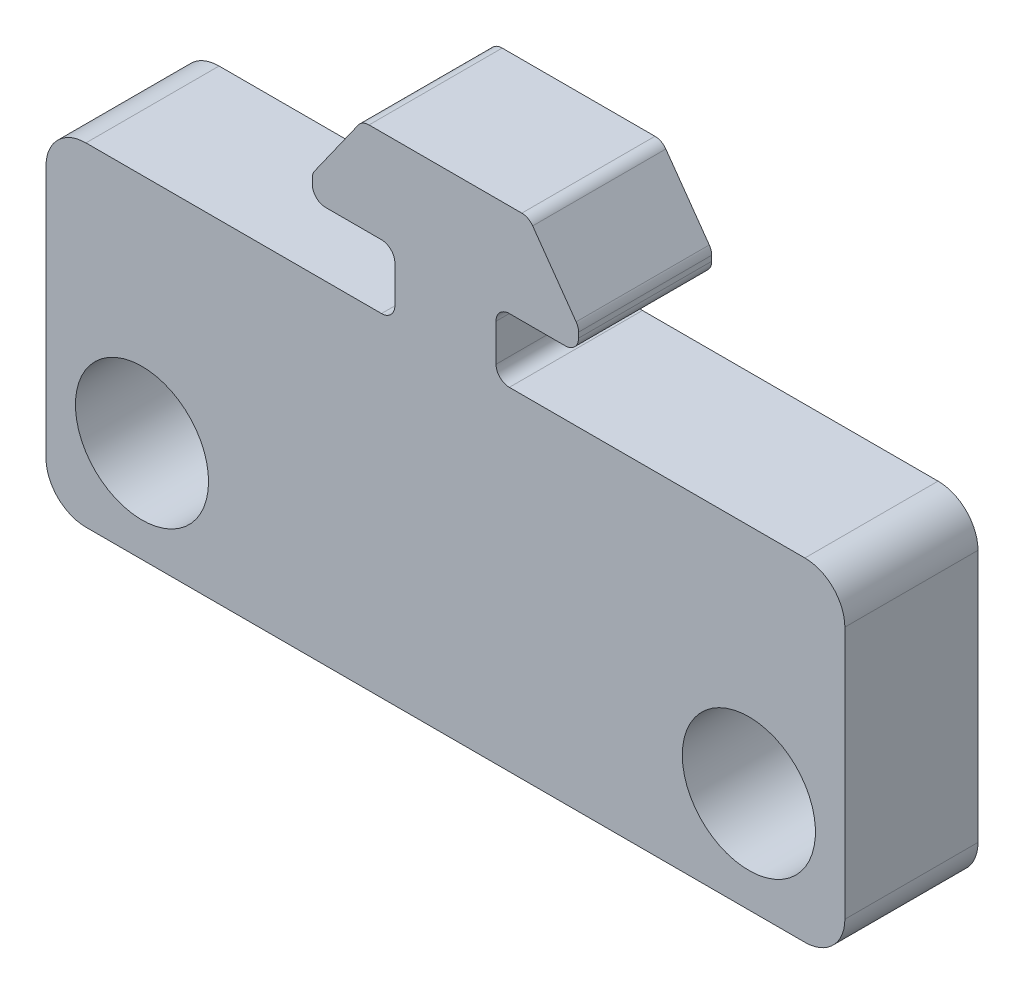
ISO-10303-21;
HEADER;
FILE_DESCRIPTION(('STEP AP214'),'2;1');
FILE_NAME('part.step','',(''),(''),'','','');
FILE_SCHEMA(('AUTOMOTIVE_DESIGN { 1 0 10303 214 1 1 1 1 }'));
ENDSEC;
DATA;
#1=APPLICATION_CONTEXT('core data for automotive mechanical design processes');
#2=APPLICATION_PROTOCOL_DEFINITION('international standard','automotive_design',2000,#1);
#3=PRODUCT_CONTEXT('',#1,'mechanical');
#4=PRODUCT('Part','Part','',(#3));
#5=PRODUCT_RELATED_PRODUCT_CATEGORY('part','',(#4));
#6=PRODUCT_DEFINITION_FORMATION('','',#4);
#7=PRODUCT_DEFINITION_CONTEXT('part definition',#1,'design');
#8=PRODUCT_DEFINITION('design','',#6,#7);
#9=PRODUCT_DEFINITION_SHAPE('','',#8);
#10=(LENGTH_UNIT() NAMED_UNIT(*) SI_UNIT(.MILLI.,.METRE.));
#11=(NAMED_UNIT(*) PLANE_ANGLE_UNIT() SI_UNIT($,.RADIAN.));
#12=(NAMED_UNIT(*) SI_UNIT($,.STERADIAN.) SOLID_ANGLE_UNIT());
#13=UNCERTAINTY_MEASURE_WITH_UNIT(LENGTH_MEASURE(1.E-05),#10,'distance_accuracy_value','');
#14=(GEOMETRIC_REPRESENTATION_CONTEXT(3) GLOBAL_UNCERTAINTY_ASSIGNED_CONTEXT((#13)) GLOBAL_UNIT_ASSIGNED_CONTEXT((#10,
#11,#12)) REPRESENTATION_CONTEXT('',''));
#15=CARTESIAN_POINT('',(0.,0.,0.));
#16=DIRECTION('',(0.,0.,1.));
#17=DIRECTION('',(1.,0.,0.));
#18=AXIS2_PLACEMENT_3D('',#15,#16,#17);
#19=CARTESIAN_POINT('',(0.,0.,10.));
#20=DIRECTION('',(0.,-1.,0.));
#21=DIRECTION('',(0.,0.,-1.));
#22=AXIS2_PLACEMENT_3D('',#19,#20,#21);
#23=PLANE('',#22);
#24=DIRECTION('',(-1.,0.,0.));
#25=VECTOR('',#24,1.);
#26=CARTESIAN_POINT('',(0.,0.,10.));
#27=LINE('',#26,#25);
#28=CARTESIAN_POINT('',(9.,0.,10.));
#29=VERTEX_POINT('',#28);
#30=CARTESIAN_POINT('',(4.8,0.,10.));
#31=VERTEX_POINT('',#30);
#32=EDGE_CURVE('E244',#29,#31,#27,.T.);
#33=ORIENTED_EDGE('',*,*,#32,.T.);
#34=DIRECTION('',(0.,0.,-1.));
#35=VECTOR('',#34,1.);
#36=CARTESIAN_POINT('',(4.8,0.,0.));
#37=LINE('',#36,#35);
#38=CARTESIAN_POINT('',(4.8,0.,0.));
#39=VERTEX_POINT('',#38);
#40=EDGE_CURVE('E349',#31,#39,#37,.T.);
#41=ORIENTED_EDGE('',*,*,#40,.T.);
#42=DIRECTION('',(-1.,0.,0.));
#43=VECTOR('',#42,1.);
#44=CARTESIAN_POINT('',(0.,0.,0.));
#45=LINE('',#44,#43);
#46=CARTESIAN_POINT('',(9.,0.,0.));
#47=VERTEX_POINT('',#46);
#48=EDGE_CURVE('E494',#47,#39,#45,.T.);
#49=ORIENTED_EDGE('',*,*,#48,.F.);
#50=DIRECTION('',(0.,0.,-1.));
#51=VECTOR('',#50,1.);
#52=CARTESIAN_POINT('',(9.,0.,10.));
#53=LINE('',#52,#51);
#54=EDGE_CURVE('E336',#47,#29,#53,.F.);
#55=ORIENTED_EDGE('',*,*,#54,.T.);
#56=EDGE_LOOP('',(#33,#41,#49,#55));
#57=FACE_BOUND('',#56,.T.);
#58=ADVANCED_FACE('F47',(#57),#23,.T.);
#59=CARTESIAN_POINT('',(-4.8,0.,0.));
#60=VERTEX_POINT('',#59);
#61=CARTESIAN_POINT('',(-9.,0.,0.));
#62=VERTEX_POINT('',#61);
#63=EDGE_CURVE('E499',#60,#62,#45,.T.);
#64=ORIENTED_EDGE('',*,*,#63,.F.);
#65=DIRECTION('',(0.,0.,-1.));
#66=VECTOR('',#65,1.);
#67=CARTESIAN_POINT('',(-4.8,0.,10.));
#68=LINE('',#67,#66);
#69=CARTESIAN_POINT('',(-4.8,0.,10.));
#70=VERTEX_POINT('',#69);
#71=EDGE_CURVE('E241',#60,#70,#68,.F.);
#72=ORIENTED_EDGE('',*,*,#71,.T.);
#73=CARTESIAN_POINT('',(-9.,0.,10.));
#74=VERTEX_POINT('',#73);
#75=EDGE_CURVE('E234',#70,#74,#27,.T.);
#76=ORIENTED_EDGE('',*,*,#75,.T.);
#77=DIRECTION('',(0.,0.,-1.));
#78=VECTOR('',#77,1.);
#79=CARTESIAN_POINT('',(-9.,0.,10.));
#80=LINE('',#79,#78);
#81=EDGE_CURVE('E239',#74,#62,#80,.T.);
#82=ORIENTED_EDGE('',*,*,#81,.T.);
#83=EDGE_LOOP('',(#64,#72,#76,#82));
#84=FACE_BOUND('',#83,.T.);
#85=ADVANCED_FACE('F237',(#84),#23,.T.);
#86=CARTESIAN_POINT('',(10.,0.,10.));
#87=DIRECTION('',(-1.,0.,0.));
#88=DIRECTION('',(0.,0.,1.));
#89=AXIS2_PLACEMENT_3D('',#86,#87,#88);
#90=PLANE('',#89);
#91=DIRECTION('',(0.,1.,0.));
#92=VECTOR('',#91,1.);
#93=CARTESIAN_POINT('',(10.,0.,10.));
#94=LINE('',#93,#92);
#95=CARTESIAN_POINT('',(10.,1.,10.));
#96=VERTEX_POINT('',#95);
#97=CARTESIAN_POINT('',(10.,1.39179018720823,10.));
#98=VERTEX_POINT('',#97);
#99=EDGE_CURVE('E479',#96,#98,#94,.T.);
#100=ORIENTED_EDGE('',*,*,#99,.F.);
#101=DIRECTION('',(0.,0.,-1.));
#102=VECTOR('',#101,1.);
#103=CARTESIAN_POINT('',(10.,1.,0.));
#104=LINE('',#103,#102);
#105=CARTESIAN_POINT('',(10.,1.,0.));
#106=VERTEX_POINT('',#105);
#107=EDGE_CURVE('E332',#96,#106,#104,.T.);
#108=ORIENTED_EDGE('',*,*,#107,.T.);
#109=DIRECTION('',(0.,1.,0.));
#110=VECTOR('',#109,1.);
#111=CARTESIAN_POINT('',(10.,0.,0.));
#112=LINE('',#111,#110);
#113=CARTESIAN_POINT('',(10.,1.39179018720823,0.));
#114=VERTEX_POINT('',#113);
#115=EDGE_CURVE('E498',#106,#114,#112,.T.);
#116=ORIENTED_EDGE('',*,*,#115,.T.);
#117=DIRECTION('',(0.,0.,-1.));
#118=VECTOR('',#117,1.);
#119=CARTESIAN_POINT('',(10.,1.39179018720823,10.));
#120=LINE('',#119,#118);
#121=EDGE_CURVE('E329',#114,#98,#120,.F.);
#122=ORIENTED_EDGE('',*,*,#121,.T.);
#123=EDGE_LOOP('',(#100,#108,#116,#122));
#124=FACE_BOUND('',#123,.T.);
#125=ADVANCED_FACE('F553',(#124),#90,.F.);
#126=CARTESIAN_POINT('',(7.46765073306512,5.28686501844186,10.));
#127=DIRECTION('',(-0.816164723344739,-0.57781930079187,0.));
#128=DIRECTION('',(0.57781930079187,-0.816164723344739,0.));
#129=AXIS2_PLACEMENT_3D('',#126,#127,#128);
#130=PLANE('',#129);
#131=DIRECTION('',(-0.57781930079187,0.816164723344739,0.));
#132=VECTOR('',#131,1.);
#133=CARTESIAN_POINT('',(7.46765073306512,5.28686501844186,0.));
#134=LINE('',#133,#132);
#135=CARTESIAN_POINT('',(9.81616472334474,1.9696094880001,0.));
#136=VERTEX_POINT('',#135);
#137=CARTESIAN_POINT('',(6.55369515590563,6.57781930079187,0.));
#138=VERTEX_POINT('',#137);
#139=EDGE_CURVE('E503',#136,#138,#134,.T.);
#140=ORIENTED_EDGE('',*,*,#139,.T.);
#141=DIRECTION('',(0.,0.,-1.));
#142=VECTOR('',#141,1.);
#143=CARTESIAN_POINT('',(6.55369515590563,6.57781930079187,10.));
#144=LINE('',#143,#142);
#145=CARTESIAN_POINT('',(6.55369515590563,6.57781930079187,10.));
#146=VERTEX_POINT('',#145);
#147=EDGE_CURVE('E326',#138,#146,#144,.F.);
#148=ORIENTED_EDGE('',*,*,#147,.T.);
#149=DIRECTION('',(-0.57781930079187,0.816164723344739,0.));
#150=VECTOR('',#149,1.);
#151=CARTESIAN_POINT('',(7.46765073306512,5.28686501844186,10.));
#152=LINE('',#151,#150);
#153=CARTESIAN_POINT('',(9.81616472334474,1.9696094880001,10.));
#154=VERTEX_POINT('',#153);
#155=EDGE_CURVE('E483',#154,#146,#152,.T.);
#156=ORIENTED_EDGE('',*,*,#155,.F.);
#157=DIRECTION('',(0.,0.,-1.));
#158=VECTOR('',#157,1.);
#159=CARTESIAN_POINT('',(9.81616472334474,1.9696094880001,10.));
#160=LINE('',#159,#158);
#161=EDGE_CURVE('E322',#154,#136,#160,.T.);
#162=ORIENTED_EDGE('',*,*,#161,.T.);
#163=EDGE_LOOP('',(#140,#148,#156,#162));
#164=FACE_BOUND('',#163,.T.);
#165=ADVANCED_FACE('F543',(#164),#130,.F.);
#166=CARTESIAN_POINT('',(0.,7.,10.));
#167=DIRECTION('',(0.,1.,0.));
#168=DIRECTION('',(0.,0.,1.));
#169=AXIS2_PLACEMENT_3D('',#166,#167,#168);
#170=PLANE('',#169);
#171=DIRECTION('',(1.,0.,0.));
#172=VECTOR('',#171,1.);
#173=CARTESIAN_POINT('',(0.,7.,0.));
#174=LINE('',#173,#172);
#175=CARTESIAN_POINT('',(-5.73753043256089,7.,0.));
#176=VERTEX_POINT('',#175);
#177=CARTESIAN_POINT('',(5.73753043256089,7.,0.));
#178=VERTEX_POINT('',#177);
#179=EDGE_CURVE('E507',#176,#178,#174,.T.);
#180=ORIENTED_EDGE('',*,*,#179,.F.);
#181=DIRECTION('',(0.,0.,-1.));
#182=VECTOR('',#181,1.);
#183=CARTESIAN_POINT('',(-5.73753043256089,7.,10.));
#184=LINE('',#183,#182);
#185=CARTESIAN_POINT('',(-5.73753043256089,7.,10.));
#186=VERTEX_POINT('',#185);
#187=EDGE_CURVE('E319',#176,#186,#184,.F.);
#188=ORIENTED_EDGE('',*,*,#187,.T.);
#189=DIRECTION('',(1.,0.,0.));
#190=VECTOR('',#189,1.);
#191=CARTESIAN_POINT('',(0.,7.,10.));
#192=LINE('',#191,#190);
#193=CARTESIAN_POINT('',(5.73753043256089,7.,10.));
#194=VERTEX_POINT('',#193);
#195=EDGE_CURVE('E487',#186,#194,#192,.T.);
#196=ORIENTED_EDGE('',*,*,#195,.T.);
#197=DIRECTION('',(0.,0.,-1.));
#198=VECTOR('',#197,1.);
#199=CARTESIAN_POINT('',(5.73753043256089,7.,0.));
#200=LINE('',#199,#198);
#201=EDGE_CURVE('E315',#194,#178,#200,.T.);
#202=ORIENTED_EDGE('',*,*,#201,.T.);
#203=EDGE_LOOP('',(#180,#188,#196,#202));
#204=FACE_BOUND('',#203,.T.);
#205=ADVANCED_FACE('F535',(#204),#170,.T.);
#206=CARTESIAN_POINT('',(-7.46765073306512,5.28686501844186,10.));
#207=DIRECTION('',(-0.816164723344739,0.57781930079187,0.));
#208=DIRECTION('',(-0.57781930079187,-0.816164723344739,0.));
#209=AXIS2_PLACEMENT_3D('',#206,#207,#208);
#210=PLANE('',#209);
#211=DIRECTION('',(0.57781930079187,0.816164723344739,0.));
#212=VECTOR('',#211,1.);
#213=CARTESIAN_POINT('',(-7.46765073306512,5.28686501844186,0.));
#214=LINE('',#213,#212);
#215=CARTESIAN_POINT('',(-9.81616472334474,1.9696094880001,0.));
#216=VERTEX_POINT('',#215);
#217=CARTESIAN_POINT('',(-6.55369515590563,6.57781930079187,0.));
#218=VERTEX_POINT('',#217);
#219=EDGE_CURVE('E510',#216,#218,#214,.T.);
#220=ORIENTED_EDGE('',*,*,#219,.F.);
#221=DIRECTION('',(0.,0.,-1.));
#222=VECTOR('',#221,1.);
#223=CARTESIAN_POINT('',(-9.81616472334474,1.9696094880001,10.));
#224=LINE('',#223,#222);
#225=CARTESIAN_POINT('',(-9.81616472334474,1.9696094880001,10.));
#226=VERTEX_POINT('',#225);
#227=EDGE_CURVE('E312',#216,#226,#224,.F.);
#228=ORIENTED_EDGE('',*,*,#227,.T.);
#229=DIRECTION('',(0.57781930079187,0.816164723344739,0.));
#230=VECTOR('',#229,1.);
#231=CARTESIAN_POINT('',(-7.46765073306512,5.28686501844186,10.));
#232=LINE('',#231,#230);
#233=CARTESIAN_POINT('',(-6.55369515590563,6.57781930079187,10.));
#234=VERTEX_POINT('',#233);
#235=EDGE_CURVE('E270',#226,#234,#232,.T.);
#236=ORIENTED_EDGE('',*,*,#235,.T.);
#237=DIRECTION('',(0.,0.,-1.));
#238=VECTOR('',#237,1.);
#239=CARTESIAN_POINT('',(-6.55369515590563,6.57781930079187,10.));
#240=LINE('',#239,#238);
#241=EDGE_CURVE('E257',#234,#218,#240,.T.);
#242=ORIENTED_EDGE('',*,*,#241,.T.);
#243=EDGE_LOOP('',(#220,#228,#236,#242));
#244=FACE_BOUND('',#243,.T.);
#245=ADVANCED_FACE('F526',(#244),#210,.T.);
#246=CARTESIAN_POINT('',(-10.,0.,10.));
#247=DIRECTION('',(-1.,0.,0.));
#248=DIRECTION('',(0.,0.,1.));
#249=AXIS2_PLACEMENT_3D('',#246,#247,#248);
#250=PLANE('',#249);
#251=DIRECTION('',(0.,1.,0.));
#252=VECTOR('',#251,1.);
#253=CARTESIAN_POINT('',(-10.,0.,0.));
#254=LINE('',#253,#252);
#255=CARTESIAN_POINT('',(-10.,1.,0.));
#256=VERTEX_POINT('',#255);
#257=CARTESIAN_POINT('',(-10.,1.39179018720823,0.));
#258=VERTEX_POINT('',#257);
#259=EDGE_CURVE('E245',#256,#258,#254,.T.);
#260=ORIENTED_EDGE('',*,*,#259,.F.);
#261=DIRECTION('',(0.,0.,-1.));
#262=VECTOR('',#261,1.);
#263=CARTESIAN_POINT('',(-10.,1.,10.));
#264=LINE('',#263,#262);
#265=CARTESIAN_POINT('',(-10.,1.,10.));
#266=VERTEX_POINT('',#265);
#267=EDGE_CURVE('E292',#256,#266,#264,.F.);
#268=ORIENTED_EDGE('',*,*,#267,.T.);
#269=DIRECTION('',(0.,1.,0.));
#270=VECTOR('',#269,1.);
#271=CARTESIAN_POINT('',(-10.,0.,10.));
#272=LINE('',#271,#270);
#273=CARTESIAN_POINT('',(-10.,1.39179018720823,10.));
#274=VERTEX_POINT('',#273);
#275=EDGE_CURVE('E253',#266,#274,#272,.T.);
#276=ORIENTED_EDGE('',*,*,#275,.T.);
#277=DIRECTION('',(0.,0.,-1.));
#278=VECTOR('',#277,1.);
#279=CARTESIAN_POINT('',(-10.,1.39179018720823,10.));
#280=LINE('',#279,#278);
#281=EDGE_CURVE('E288',#274,#258,#280,.T.);
#282=ORIENTED_EDGE('',*,*,#281,.T.);
#283=EDGE_LOOP('',(#260,#268,#276,#282));
#284=FACE_BOUND('',#283,.T.);
#285=ADVANCED_FACE('F518',(#284),#250,.T.);
#286=CARTESIAN_POINT('',(0.,0.,10.));
#287=DIRECTION('',(0.,0.,1.));
#288=DIRECTION('',(1.,0.,0.));
#289=AXIS2_PLACEMENT_3D('',#286,#287,#288);
#290=PLANE('',#289);
#291=CARTESIAN_POINT('',(-22.7909760636939,-22.227391231648,10.));
#292=DIRECTION('',(0.,0.,1.));
#293=DIRECTION('',(1.,0.,0.));
#294=AXIS2_PLACEMENT_3D('',#291,#292,#293);
#295=CIRCLE('',#294,5.);
#296=CARTESIAN_POINT('',(-17.7909760636939,-22.227391231648,10.));
#297=VERTEX_POINT('',#296);
#298=EDGE_CURVE('E457',#297,#297,#295,.T.);
#299=ORIENTED_EDGE('',*,*,#298,.F.);
#300=EDGE_LOOP('',(#299));
#301=FACE_BOUND('',#300,.T.);
#302=CARTESIAN_POINT('',(22.7909760636939,-22.227391231648,10.));
#303=DIRECTION('',(0.,0.,1.));
#304=DIRECTION('',(-1.,0.,0.));
#305=AXIS2_PLACEMENT_3D('',#302,#303,#304);
#306=CIRCLE('',#305,5.);
#307=CARTESIAN_POINT('',(17.7909760636939,-22.227391231648,10.));
#308=VERTEX_POINT('',#307);
#309=EDGE_CURVE('E920',#308,#308,#306,.T.);
#310=ORIENTED_EDGE('',*,*,#309,.F.);
#311=EDGE_LOOP('',(#310));
#312=FACE_BOUND('',#311,.T.);
#313=DIRECTION('',(-1.,0.,0.));
#314=VECTOR('',#313,1.);
#315=CARTESIAN_POINT('',(0.,-4.8,10.));
#316=LINE('',#315,#314);
#317=CARTESIAN_POINT('',(-4.8,-4.8,10.));
#318=VERTEX_POINT('',#317);
#319=CARTESIAN_POINT('',(-27.,-4.8,10.));
#320=VERTEX_POINT('',#319);
#321=EDGE_CURVE('E599',#318,#320,#316,.T.);
#322=ORIENTED_EDGE('',*,*,#321,.T.);
#323=CARTESIAN_POINT('',(-27.,-7.8,10.));
#324=DIRECTION('',(0.,0.,1.));
#325=DIRECTION('',(1.,0.,0.));
#326=AXIS2_PLACEMENT_3D('',#323,#324,#325);
#327=CIRCLE('',#326,3.);
#328=CARTESIAN_POINT('',(-30.,-7.8,10.));
#329=VERTEX_POINT('',#328);
#330=EDGE_CURVE('E419',#320,#329,#327,.T.);
#331=ORIENTED_EDGE('',*,*,#330,.T.);
#332=DIRECTION('',(0.,-1.,0.));
#333=VECTOR('',#332,1.);
#334=CARTESIAN_POINT('',(-30.,0.,10.));
#335=LINE('',#334,#333);
#336=CARTESIAN_POINT('',(-30.,-26.8,10.));
#337=VERTEX_POINT('',#336);
#338=EDGE_CURVE('E601',#329,#337,#335,.T.);
#339=ORIENTED_EDGE('',*,*,#338,.T.);
#340=CARTESIAN_POINT('',(-27.,-26.8,10.));
#341=DIRECTION('',(0.,0.,1.));
#342=DIRECTION('',(1.,0.,0.));
#343=AXIS2_PLACEMENT_3D('',#340,#341,#342);
#344=CIRCLE('',#343,3.);
#345=CARTESIAN_POINT('',(-27.,-29.8,10.));
#346=VERTEX_POINT('',#345);
#347=EDGE_CURVE('E416',#337,#346,#344,.T.);
#348=ORIENTED_EDGE('',*,*,#347,.T.);
#349=DIRECTION('',(1.,0.,0.));
#350=VECTOR('',#349,1.);
#351=CARTESIAN_POINT('',(0.,-29.8,10.));
#352=LINE('',#351,#350);
#353=CARTESIAN_POINT('',(27.,-29.8,10.));
#354=VERTEX_POINT('',#353);
#355=EDGE_CURVE('E475',#346,#354,#352,.T.);
#356=ORIENTED_EDGE('',*,*,#355,.T.);
#357=CARTESIAN_POINT('',(27.,-26.8,10.));
#358=DIRECTION('',(0.,0.,1.));
#359=DIRECTION('',(1.,0.,0.));
#360=AXIS2_PLACEMENT_3D('',#357,#358,#359);
#361=CIRCLE('',#360,3.);
#362=CARTESIAN_POINT('',(30.,-26.8,10.));
#363=VERTEX_POINT('',#362);
#364=EDGE_CURVE('E69',#354,#363,#361,.T.);
#365=ORIENTED_EDGE('',*,*,#364,.T.);
#366=DIRECTION('',(0.,-1.,0.));
#367=VECTOR('',#366,1.);
#368=CARTESIAN_POINT('',(30.,0.,10.));
#369=LINE('',#368,#367);
#370=CARTESIAN_POINT('',(30.,-7.8,10.));
#371=VERTEX_POINT('',#370);
#372=EDGE_CURVE('E441',#371,#363,#369,.T.);
#373=ORIENTED_EDGE('',*,*,#372,.F.);
#374=CARTESIAN_POINT('',(27.,-7.8,10.));
#375=DIRECTION('',(0.,0.,1.));
#376=DIRECTION('',(1.,0.,0.));
#377=AXIS2_PLACEMENT_3D('',#374,#375,#376);
#378=CIRCLE('',#377,3.);
#379=CARTESIAN_POINT('',(27.,-4.8,10.));
#380=VERTEX_POINT('',#379);
#381=EDGE_CURVE('E63',#371,#380,#378,.T.);
#382=ORIENTED_EDGE('',*,*,#381,.T.);
#383=DIRECTION('',(1.,0.,0.));
#384=VECTOR('',#383,1.);
#385=CARTESIAN_POINT('',(0.,-4.8,10.));
#386=LINE('',#385,#384);
#387=CARTESIAN_POINT('',(4.8,-4.8,10.));
#388=VERTEX_POINT('',#387);
#389=EDGE_CURVE('E582',#388,#380,#386,.T.);
#390=ORIENTED_EDGE('',*,*,#389,.F.);
#391=CARTESIAN_POINT('',(4.8,-3.8,10.));
#392=DIRECTION('',(0.,0.,1.));
#393=DIRECTION('',(1.,0.,0.));
#394=AXIS2_PLACEMENT_3D('',#391,#392,#393);
#395=CIRCLE('',#394,1.);
#396=CARTESIAN_POINT('',(3.8,-3.8,10.));
#397=VERTEX_POINT('',#396);
#398=EDGE_CURVE('E369',#388,#397,#395,.F.);
#399=ORIENTED_EDGE('',*,*,#398,.T.);
#400=DIRECTION('',(0.,-1.,0.));
#401=VECTOR('',#400,1.);
#402=CARTESIAN_POINT('',(3.8,0.,10.));
#403=LINE('',#402,#401);
#404=CARTESIAN_POINT('',(3.8,-1.,10.));
#405=VERTEX_POINT('',#404);
#406=EDGE_CURVE('E573',#405,#397,#403,.T.);
#407=ORIENTED_EDGE('',*,*,#406,.F.);
#408=CARTESIAN_POINT('',(4.8,-1.,10.));
#409=DIRECTION('',(0.,0.,1.));
#410=DIRECTION('',(1.,0.,0.));
#411=AXIS2_PLACEMENT_3D('',#408,#409,#410);
#412=CIRCLE('',#411,1.);
#413=EDGE_CURVE('E375',#405,#31,#412,.F.);
#414=ORIENTED_EDGE('',*,*,#413,.T.);
#415=ORIENTED_EDGE('',*,*,#32,.F.);
#416=CARTESIAN_POINT('',(9.,1.,10.));
#417=DIRECTION('',(0.,0.,1.));
#418=DIRECTION('',(1.,0.,0.));
#419=AXIS2_PLACEMENT_3D('',#416,#417,#418);
#420=CIRCLE('',#419,1.);
#421=EDGE_CURVE('E298',#29,#96,#420,.T.);
#422=ORIENTED_EDGE('',*,*,#421,.T.);
#423=ORIENTED_EDGE('',*,*,#99,.T.);
#424=CARTESIAN_POINT('',(9.,1.39179018720823,10.));
#425=DIRECTION('',(0.,0.,1.));
#426=DIRECTION('',(1.,0.,0.));
#427=AXIS2_PLACEMENT_3D('',#424,#425,#426);
#428=CIRCLE('',#427,1.);
#429=EDGE_CURVE('E295',#98,#154,#428,.T.);
#430=ORIENTED_EDGE('',*,*,#429,.T.);
#431=ORIENTED_EDGE('',*,*,#155,.T.);
#432=CARTESIAN_POINT('',(5.73753043256089,6.,10.));
#433=DIRECTION('',(0.,0.,1.));
#434=DIRECTION('',(1.,0.,0.));
#435=AXIS2_PLACEMENT_3D('',#432,#433,#434);
#436=CIRCLE('',#435,1.);
#437=EDGE_CURVE('E301',#146,#194,#436,.T.);
#438=ORIENTED_EDGE('',*,*,#437,.T.);
#439=ORIENTED_EDGE('',*,*,#195,.F.);
#440=CARTESIAN_POINT('',(-5.73753043256089,6.,10.));
#441=DIRECTION('',(0.,0.,1.));
#442=DIRECTION('',(1.,0.,0.));
#443=AXIS2_PLACEMENT_3D('',#440,#441,#442);
#444=CIRCLE('',#443,1.);
#445=EDGE_CURVE('E304',#186,#234,#444,.T.);
#446=ORIENTED_EDGE('',*,*,#445,.T.);
#447=ORIENTED_EDGE('',*,*,#235,.F.);
#448=CARTESIAN_POINT('',(-9.,1.39179018720823,10.));
#449=DIRECTION('',(0.,0.,1.));
#450=DIRECTION('',(1.,0.,0.));
#451=AXIS2_PLACEMENT_3D('',#448,#449,#450);
#452=CIRCLE('',#451,1.);
#453=EDGE_CURVE('E258',#226,#274,#452,.T.);
#454=ORIENTED_EDGE('',*,*,#453,.T.);
#455=ORIENTED_EDGE('',*,*,#275,.F.);
#456=CARTESIAN_POINT('',(-9.,1.,10.));
#457=DIRECTION('',(0.,0.,1.));
#458=DIRECTION('',(1.,0.,0.));
#459=AXIS2_PLACEMENT_3D('',#456,#457,#458);
#460=CIRCLE('',#459,1.);
#461=EDGE_CURVE('E249',#266,#74,#460,.T.);
#462=ORIENTED_EDGE('',*,*,#461,.T.);
#463=ORIENTED_EDGE('',*,*,#75,.F.);
#464=CARTESIAN_POINT('',(-4.8,-1.,10.));
#465=DIRECTION('',(0.,0.,1.));
#466=DIRECTION('',(1.,0.,0.));
#467=AXIS2_PLACEMENT_3D('',#464,#465,#466);
#468=CIRCLE('',#467,1.);
#469=CARTESIAN_POINT('',(-3.8,-1.,10.));
#470=VERTEX_POINT('',#469);
#471=EDGE_CURVE('E387',#70,#470,#468,.F.);
#472=ORIENTED_EDGE('',*,*,#471,.T.);
#473=DIRECTION('',(0.,-1.,0.));
#474=VECTOR('',#473,1.);
#475=CARTESIAN_POINT('',(-3.8,0.,10.));
#476=LINE('',#475,#474);
#477=CARTESIAN_POINT('',(-3.8,-3.8,10.));
#478=VERTEX_POINT('',#477);
#479=EDGE_CURVE('E595',#470,#478,#476,.T.);
#480=ORIENTED_EDGE('',*,*,#479,.T.);
#481=CARTESIAN_POINT('',(-4.8,-3.8,10.));
#482=DIRECTION('',(0.,0.,1.));
#483=DIRECTION('',(1.,0.,0.));
#484=AXIS2_PLACEMENT_3D('',#481,#482,#483);
#485=CIRCLE('',#484,1.);
#486=EDGE_CURVE('E381',#478,#318,#485,.F.);
#487=ORIENTED_EDGE('',*,*,#486,.T.);
#488=EDGE_LOOP('',(#322,#331,#339,#348,#356,#365,#373,#382,#390,#399,#407,#414,#415,#422,#423,
#430,#431,#438,#439,#446,#447,#454,#455,#462,#463,#472,#480,#487));
#489=FACE_BOUND('',#488,.T.);
#490=ADVANCED_FACE('F251',(#301,#312,#489),#290,.T.);
#491=CARTESIAN_POINT('',(0.,0.,0.));
#492=DIRECTION('',(0.,0.,1.));
#493=DIRECTION('',(1.,0.,0.));
#494=AXIS2_PLACEMENT_3D('',#491,#492,#493);
#495=PLANE('',#494);
#496=CARTESIAN_POINT('',(-22.7909760636939,-22.227391231648,0.));
#497=DIRECTION('',(0.,0.,1.));
#498=DIRECTION('',(1.,0.,0.));
#499=AXIS2_PLACEMENT_3D('',#496,#497,#498);
#500=CIRCLE('',#499,5.);
#501=CARTESIAN_POINT('',(-17.7909760636939,-22.227391231648,0.));
#502=VERTEX_POINT('',#501);
#503=EDGE_CURVE('E925',#502,#502,#500,.T.);
#504=ORIENTED_EDGE('',*,*,#503,.T.);
#505=EDGE_LOOP('',(#504));
#506=FACE_BOUND('',#505,.T.);
#507=CARTESIAN_POINT('',(22.7909760636939,-22.227391231648,0.));
#508=DIRECTION('',(0.,0.,1.));
#509=DIRECTION('',(-1.,0.,0.));
#510=AXIS2_PLACEMENT_3D('',#507,#508,#509);
#511=CIRCLE('',#510,5.);
#512=CARTESIAN_POINT('',(17.7909760636939,-22.227391231648,0.));
#513=VERTEX_POINT('',#512);
#514=EDGE_CURVE('E922',#513,#513,#511,.T.);
#515=ORIENTED_EDGE('',*,*,#514,.T.);
#516=EDGE_LOOP('',(#515));
#517=FACE_BOUND('',#516,.T.);
#518=DIRECTION('',(0.,-1.,0.));
#519=VECTOR('',#518,1.);
#520=CARTESIAN_POINT('',(-30.,0.,0.));
#521=LINE('',#520,#519);
#522=CARTESIAN_POINT('',(-30.,-7.8,0.));
#523=VERTEX_POINT('',#522);
#524=CARTESIAN_POINT('',(-30.,-26.8,0.));
#525=VERTEX_POINT('',#524);
#526=EDGE_CURVE('E472',#523,#525,#521,.T.);
#527=ORIENTED_EDGE('',*,*,#526,.F.);
#528=CARTESIAN_POINT('',(-27.,-7.8,0.));
#529=DIRECTION('',(0.,0.,1.));
#530=DIRECTION('',(1.,0.,0.));
#531=AXIS2_PLACEMENT_3D('',#528,#529,#530);
#532=CIRCLE('',#531,3.);
#533=CARTESIAN_POINT('',(-27.,-4.8,0.));
#534=VERTEX_POINT('',#533);
#535=EDGE_CURVE('E406',#523,#534,#532,.F.);
#536=ORIENTED_EDGE('',*,*,#535,.T.);
#537=DIRECTION('',(-1.,0.,0.));
#538=VECTOR('',#537,1.);
#539=CARTESIAN_POINT('',(0.,-4.8,0.));
#540=LINE('',#539,#538);
#541=CARTESIAN_POINT('',(-4.8,-4.8,0.));
#542=VERTEX_POINT('',#541);
#543=EDGE_CURVE('E468',#542,#534,#540,.T.);
#544=ORIENTED_EDGE('',*,*,#543,.F.);
#545=CARTESIAN_POINT('',(-4.8,-3.8,0.));
#546=DIRECTION('',(0.,0.,1.));
#547=DIRECTION('',(1.,0.,0.));
#548=AXIS2_PLACEMENT_3D('',#545,#546,#547);
#549=CIRCLE('',#548,1.);
#550=CARTESIAN_POINT('',(-3.8,-3.8,0.));
#551=VERTEX_POINT('',#550);
#552=EDGE_CURVE('E378',#542,#551,#549,.T.);
#553=ORIENTED_EDGE('',*,*,#552,.T.);
#554=DIRECTION('',(0.,-1.,0.));
#555=VECTOR('',#554,1.);
#556=CARTESIAN_POINT('',(-3.8,0.,0.));
#557=LINE('',#556,#555);
#558=CARTESIAN_POINT('',(-3.8,-1.,0.));
#559=VERTEX_POINT('',#558);
#560=EDGE_CURVE('E464',#559,#551,#557,.T.);
#561=ORIENTED_EDGE('',*,*,#560,.F.);
#562=CARTESIAN_POINT('',(-4.8,-1.,0.));
#563=DIRECTION('',(0.,0.,1.));
#564=DIRECTION('',(1.,0.,0.));
#565=AXIS2_PLACEMENT_3D('',#562,#563,#564);
#566=CIRCLE('',#565,1.);
#567=EDGE_CURVE('E384',#559,#60,#566,.T.);
#568=ORIENTED_EDGE('',*,*,#567,.T.);
#569=ORIENTED_EDGE('',*,*,#63,.T.);
#570=CARTESIAN_POINT('',(-9.,1.,0.));
#571=DIRECTION('',(0.,0.,1.));
#572=DIRECTION('',(1.,0.,0.));
#573=AXIS2_PLACEMENT_3D('',#570,#571,#572);
#574=CIRCLE('',#573,1.);
#575=EDGE_CURVE('E262',#62,#256,#574,.F.);
#576=ORIENTED_EDGE('',*,*,#575,.T.);
#577=ORIENTED_EDGE('',*,*,#259,.T.);
#578=CARTESIAN_POINT('',(-9.,1.39179018720823,0.));
#579=DIRECTION('',(0.,0.,1.));
#580=DIRECTION('',(1.,0.,0.));
#581=AXIS2_PLACEMENT_3D('',#578,#579,#580);
#582=CIRCLE('',#581,1.);
#583=EDGE_CURVE('E283',#258,#216,#582,.F.);
#584=ORIENTED_EDGE('',*,*,#583,.T.);
#585=ORIENTED_EDGE('',*,*,#219,.T.);
#586=CARTESIAN_POINT('',(-5.73753043256089,6.,0.));
#587=DIRECTION('',(0.,0.,1.));
#588=DIRECTION('',(1.,0.,0.));
#589=AXIS2_PLACEMENT_3D('',#586,#587,#588);
#590=CIRCLE('',#589,1.);
#591=EDGE_CURVE('E280',#218,#176,#590,.F.);
#592=ORIENTED_EDGE('',*,*,#591,.T.);
#593=ORIENTED_EDGE('',*,*,#179,.T.);
#594=CARTESIAN_POINT('',(5.73753043256089,6.,0.));
#595=DIRECTION('',(0.,0.,1.));
#596=DIRECTION('',(1.,0.,0.));
#597=AXIS2_PLACEMENT_3D('',#594,#595,#596);
#598=CIRCLE('',#597,1.);
#599=EDGE_CURVE('E277',#178,#138,#598,.F.);
#600=ORIENTED_EDGE('',*,*,#599,.T.);
#601=ORIENTED_EDGE('',*,*,#139,.F.);
#602=CARTESIAN_POINT('',(9.,1.39179018720823,0.));
#603=DIRECTION('',(0.,0.,1.));
#604=DIRECTION('',(1.,0.,0.));
#605=AXIS2_PLACEMENT_3D('',#602,#603,#604);
#606=CIRCLE('',#605,1.);
#607=EDGE_CURVE('E264',#136,#114,#606,.F.);
#608=ORIENTED_EDGE('',*,*,#607,.T.);
#609=ORIENTED_EDGE('',*,*,#115,.F.);
#610=CARTESIAN_POINT('',(9.,1.,0.));
#611=DIRECTION('',(0.,0.,1.));
#612=DIRECTION('',(1.,0.,0.));
#613=AXIS2_PLACEMENT_3D('',#610,#611,#612);
#614=CIRCLE('',#613,1.);
#615=EDGE_CURVE('E268',#106,#47,#614,.F.);
#616=ORIENTED_EDGE('',*,*,#615,.T.);
#617=ORIENTED_EDGE('',*,*,#48,.T.);
#618=CARTESIAN_POINT('',(4.8,-1.,0.));
#619=DIRECTION('',(0.,0.,1.));
#620=DIRECTION('',(1.,0.,0.));
#621=AXIS2_PLACEMENT_3D('',#618,#619,#620);
#622=CIRCLE('',#621,1.);
#623=CARTESIAN_POINT('',(3.8,-1.,0.));
#624=VERTEX_POINT('',#623);
#625=EDGE_CURVE('E372',#39,#624,#622,.T.);
#626=ORIENTED_EDGE('',*,*,#625,.T.);
#627=DIRECTION('',(0.,-1.,0.));
#628=VECTOR('',#627,1.);
#629=CARTESIAN_POINT('',(3.8,0.,0.));
#630=LINE('',#629,#628);
#631=CARTESIAN_POINT('',(3.8,-3.8,0.));
#632=VERTEX_POINT('',#631);
#633=EDGE_CURVE('E455',#624,#632,#630,.T.);
#634=ORIENTED_EDGE('',*,*,#633,.T.);
#635=CARTESIAN_POINT('',(4.8,-3.8,0.));
#636=DIRECTION('',(0.,0.,1.));
#637=DIRECTION('',(1.,0.,0.));
#638=AXIS2_PLACEMENT_3D('',#635,#636,#637);
#639=CIRCLE('',#638,1.);
#640=CARTESIAN_POINT('',(4.8,-4.8,0.));
#641=VERTEX_POINT('',#640);
#642=EDGE_CURVE('E366',#632,#641,#639,.T.);
#643=ORIENTED_EDGE('',*,*,#642,.T.);
#644=DIRECTION('',(1.,0.,0.));
#645=VECTOR('',#644,1.);
#646=CARTESIAN_POINT('',(0.,-4.8,0.));
#647=LINE('',#646,#645);
#648=CARTESIAN_POINT('',(27.,-4.8,0.));
#649=VERTEX_POINT('',#648);
#650=EDGE_CURVE('E450',#641,#649,#647,.T.);
#651=ORIENTED_EDGE('',*,*,#650,.T.);
#652=CARTESIAN_POINT('',(27.,-7.8,0.));
#653=DIRECTION('',(0.,0.,1.));
#654=DIRECTION('',(1.,0.,0.));
#655=AXIS2_PLACEMENT_3D('',#652,#653,#654);
#656=CIRCLE('',#655,3.);
#657=CARTESIAN_POINT('',(30.,-7.8,0.));
#658=VERTEX_POINT('',#657);
#659=EDGE_CURVE('E400',#649,#658,#656,.F.);
#660=ORIENTED_EDGE('',*,*,#659,.T.);
#661=DIRECTION('',(0.,-1.,0.));
#662=VECTOR('',#661,1.);
#663=CARTESIAN_POINT('',(30.,0.,0.));
#664=LINE('',#663,#662);
#665=CARTESIAN_POINT('',(30.,-26.8,0.));
#666=VERTEX_POINT('',#665);
#667=EDGE_CURVE('E439',#658,#666,#664,.T.);
#668=ORIENTED_EDGE('',*,*,#667,.T.);
#669=CARTESIAN_POINT('',(27.,-26.8,0.));
#670=DIRECTION('',(0.,0.,1.));
#671=DIRECTION('',(1.,0.,0.));
#672=AXIS2_PLACEMENT_3D('',#669,#670,#671);
#673=CIRCLE('',#672,3.);
#674=CARTESIAN_POINT('',(27.,-29.8,0.));
#675=VERTEX_POINT('',#674);
#676=EDGE_CURVE('E397',#666,#675,#673,.F.);
#677=ORIENTED_EDGE('',*,*,#676,.T.);
#678=DIRECTION('',(1.,0.,0.));
#679=VECTOR('',#678,1.);
#680=CARTESIAN_POINT('',(0.,-29.8,0.));
#681=LINE('',#680,#679);
#682=CARTESIAN_POINT('',(-27.,-29.8,0.));
#683=VERTEX_POINT('',#682);
#684=EDGE_CURVE('E451',#683,#675,#681,.T.);
#685=ORIENTED_EDGE('',*,*,#684,.F.);
#686=CARTESIAN_POINT('',(-27.,-26.8,0.));
#687=DIRECTION('',(0.,0.,1.));
#688=DIRECTION('',(1.,0.,0.));
#689=AXIS2_PLACEMENT_3D('',#686,#687,#688);
#690=CIRCLE('',#689,3.);
#691=EDGE_CURVE('E403',#683,#525,#690,.F.);
#692=ORIENTED_EDGE('',*,*,#691,.T.);
#693=EDGE_LOOP('',(#527,#536,#544,#553,#561,#568,#569,#576,#577,#584,#585,#592,#593,#600,#601,
#608,#609,#616,#617,#626,#634,#643,#651,#660,#668,#677,#685,#692));
#694=FACE_BOUND('',#693,.T.);
#695=ADVANCED_FACE('F445',(#506,#517,#694),#495,.F.);
#696=CARTESIAN_POINT('',(0.,-29.8,10.));
#697=DIRECTION('',(0.,1.,0.));
#698=DIRECTION('',(-1.,0.,0.));
#699=AXIS2_PLACEMENT_3D('',#696,#697,#698);
#700=PLANE('',#699);
#701=ORIENTED_EDGE('',*,*,#355,.F.);
#702=DIRECTION('',(0.,0.,-1.));
#703=VECTOR('',#702,1.);
#704=CARTESIAN_POINT('',(-27.,-29.8,10.));
#705=LINE('',#704,#703);
#706=EDGE_CURVE('E425',#346,#683,#705,.T.);
#707=ORIENTED_EDGE('',*,*,#706,.T.);
#708=ORIENTED_EDGE('',*,*,#684,.T.);
#709=DIRECTION('',(0.,0.,-1.));
#710=VECTOR('',#709,1.);
#711=CARTESIAN_POINT('',(27.,-29.8,10.));
#712=LINE('',#711,#710);
#713=EDGE_CURVE('E422',#675,#354,#712,.F.);
#714=ORIENTED_EDGE('',*,*,#713,.T.);
#715=EDGE_LOOP('',(#701,#707,#708,#714));
#716=FACE_BOUND('',#715,.T.);
#717=ADVANCED_FACE('F636',(#716),#700,.F.);
#718=CARTESIAN_POINT('',(30.,0.,10.));
#719=DIRECTION('',(1.,0.,0.));
#720=DIRECTION('',(0.,0.,-1.));
#721=AXIS2_PLACEMENT_3D('',#718,#719,#720);
#722=PLANE('',#721);
#723=ORIENTED_EDGE('',*,*,#667,.F.);
#724=DIRECTION('',(0.,0.,-1.));
#725=VECTOR('',#724,1.);
#726=CARTESIAN_POINT('',(30.,-7.8,10.));
#727=LINE('',#726,#725);
#728=EDGE_CURVE('E11',#658,#371,#727,.F.);
#729=ORIENTED_EDGE('',*,*,#728,.T.);
#730=ORIENTED_EDGE('',*,*,#372,.T.);
#731=DIRECTION('',(0.,0.,-1.));
#732=VECTOR('',#731,1.);
#733=CARTESIAN_POINT('',(30.,-26.8,0.));
#734=LINE('',#733,#732);
#735=EDGE_CURVE('E56',#363,#666,#734,.T.);
#736=ORIENTED_EDGE('',*,*,#735,.T.);
#737=EDGE_LOOP('',(#723,#729,#730,#736));
#738=FACE_BOUND('',#737,.T.);
#739=ADVANCED_FACE('F438',(#738),#722,.T.);
#740=CARTESIAN_POINT('',(0.,-4.8,10.));
#741=DIRECTION('',(0.,1.,0.));
#742=DIRECTION('',(-1.,0.,0.));
#743=AXIS2_PLACEMENT_3D('',#740,#741,#742);
#744=PLANE('',#743);
#745=ORIENTED_EDGE('',*,*,#389,.T.);
#746=DIRECTION('',(0.,0.,-1.));
#747=VECTOR('',#746,1.);
#748=CARTESIAN_POINT('',(27.,-4.8,10.));
#749=LINE('',#748,#747);
#750=EDGE_CURVE('E429',#380,#649,#749,.T.);
#751=ORIENTED_EDGE('',*,*,#750,.T.);
#752=ORIENTED_EDGE('',*,*,#650,.F.);
#753=DIRECTION('',(0.,0.,-1.));
#754=VECTOR('',#753,1.);
#755=CARTESIAN_POINT('',(4.8,-4.8,10.));
#756=LINE('',#755,#754);
#757=EDGE_CURVE('E346',#641,#388,#756,.F.);
#758=ORIENTED_EDGE('',*,*,#757,.T.);
#759=EDGE_LOOP('',(#745,#751,#752,#758));
#760=FACE_BOUND('',#759,.T.);
#761=ADVANCED_FACE('F580',(#760),#744,.T.);
#762=CARTESIAN_POINT('',(3.8,0.,10.));
#763=DIRECTION('',(1.,0.,0.));
#764=DIRECTION('',(0.,1.,0.));
#765=AXIS2_PLACEMENT_3D('',#762,#763,#764);
#766=PLANE('',#765);
#767=ORIENTED_EDGE('',*,*,#406,.T.);
#768=DIRECTION('',(0.,0.,-1.));
#769=VECTOR('',#768,1.);
#770=CARTESIAN_POINT('',(3.8,-3.8,0.));
#771=LINE('',#770,#769);
#772=EDGE_CURVE('E342',#397,#632,#771,.T.);
#773=ORIENTED_EDGE('',*,*,#772,.T.);
#774=ORIENTED_EDGE('',*,*,#633,.F.);
#775=DIRECTION('',(0.,0.,-1.));
#776=VECTOR('',#775,1.);
#777=CARTESIAN_POINT('',(3.8,-1.,10.));
#778=LINE('',#777,#776);
#779=EDGE_CURVE('E339',#624,#405,#778,.F.);
#780=ORIENTED_EDGE('',*,*,#779,.T.);
#781=EDGE_LOOP('',(#767,#773,#774,#780));
#782=FACE_BOUND('',#781,.T.);
#783=ADVANCED_FACE('F570',(#782),#766,.T.);
#784=CARTESIAN_POINT('',(-3.8,0.,10.));
#785=DIRECTION('',(1.,0.,0.));
#786=DIRECTION('',(0.,1.,0.));
#787=AXIS2_PLACEMENT_3D('',#784,#785,#786);
#788=PLANE('',#787);
#789=ORIENTED_EDGE('',*,*,#560,.T.);
#790=DIRECTION('',(0.,0.,-1.));
#791=VECTOR('',#790,1.);
#792=CARTESIAN_POINT('',(-3.8,-3.8,10.));
#793=LINE('',#792,#791);
#794=EDGE_CURVE('E361',#551,#478,#793,.F.);
#795=ORIENTED_EDGE('',*,*,#794,.T.);
#796=ORIENTED_EDGE('',*,*,#479,.F.);
#797=DIRECTION('',(0.,0.,-1.));
#798=VECTOR('',#797,1.);
#799=CARTESIAN_POINT('',(-3.8,-1.,10.));
#800=LINE('',#799,#798);
#801=EDGE_CURVE('E357',#470,#559,#800,.T.);
#802=ORIENTED_EDGE('',*,*,#801,.T.);
#803=EDGE_LOOP('',(#789,#795,#796,#802));
#804=FACE_BOUND('',#803,.T.);
#805=ADVANCED_FACE('F614',(#804),#788,.F.);
#806=CARTESIAN_POINT('',(0.,-4.8,10.));
#807=DIRECTION('',(0.,-1.,0.));
#808=DIRECTION('',(1.,0.,0.));
#809=AXIS2_PLACEMENT_3D('',#806,#807,#808);
#810=PLANE('',#809);
#811=ORIENTED_EDGE('',*,*,#543,.T.);
#812=DIRECTION('',(0.,0.,-1.));
#813=VECTOR('',#812,1.);
#814=CARTESIAN_POINT('',(-27.,-4.8,10.));
#815=LINE('',#814,#813);
#816=EDGE_CURVE('E409',#534,#320,#815,.F.);
#817=ORIENTED_EDGE('',*,*,#816,.T.);
#818=ORIENTED_EDGE('',*,*,#321,.F.);
#819=DIRECTION('',(0.,0.,-1.));
#820=VECTOR('',#819,1.);
#821=CARTESIAN_POINT('',(-4.8,-4.8,0.));
#822=LINE('',#821,#820);
#823=EDGE_CURVE('E353',#318,#542,#822,.T.);
#824=ORIENTED_EDGE('',*,*,#823,.T.);
#825=EDGE_LOOP('',(#811,#817,#818,#824));
#826=FACE_BOUND('',#825,.T.);
#827=ADVANCED_FACE('F622',(#826),#810,.F.);
#828=CARTESIAN_POINT('',(-30.,0.,10.));
#829=DIRECTION('',(1.,0.,0.));
#830=DIRECTION('',(0.,0.,-1.));
#831=AXIS2_PLACEMENT_3D('',#828,#829,#830);
#832=PLANE('',#831);
#833=ORIENTED_EDGE('',*,*,#338,.F.);
#834=DIRECTION('',(0.,0.,-1.));
#835=VECTOR('',#834,1.);
#836=CARTESIAN_POINT('',(-30.,-7.8,10.));
#837=LINE('',#836,#835);
#838=EDGE_CURVE('E393',#329,#523,#837,.T.);
#839=ORIENTED_EDGE('',*,*,#838,.T.);
#840=ORIENTED_EDGE('',*,*,#526,.T.);
#841=DIRECTION('',(0.,0.,-1.));
#842=VECTOR('',#841,1.);
#843=CARTESIAN_POINT('',(-30.,-26.8,10.));
#844=LINE('',#843,#842);
#845=EDGE_CURVE('E390',#525,#337,#844,.F.);
#846=ORIENTED_EDGE('',*,*,#845,.T.);
#847=EDGE_LOOP('',(#833,#839,#840,#846));
#848=FACE_BOUND('',#847,.T.);
#849=ADVANCED_FACE('F629',(#848),#832,.F.);
#850=CARTESIAN_POINT('',(22.7909760636939,-22.227391231648,10.));
#851=DIRECTION('',(0.,0.,-1.));
#852=DIRECTION('',(-1.,0.,0.));
#853=AXIS2_PLACEMENT_3D('',#850,#851,#852);
#854=CYLINDRICAL_SURFACE('',#853,5.);
#855=ORIENTED_EDGE('',*,*,#309,.T.);
#856=EDGE_LOOP('',(#855));
#857=FACE_BOUND('',#856,.T.);
#858=ORIENTED_EDGE('',*,*,#514,.F.);
#859=EDGE_LOOP('',(#858));
#860=FACE_BOUND('',#859,.T.);
#861=ADVANCED_FACE('F752',(#857,#860),#854,.F.);
#862=CARTESIAN_POINT('',(-22.7909760636939,-22.227391231648,10.));
#863=DIRECTION('',(0.,0.,-1.));
#864=DIRECTION('',(-1.,0.,0.));
#865=AXIS2_PLACEMENT_3D('',#862,#863,#864);
#866=CYLINDRICAL_SURFACE('',#865,5.);
#867=ORIENTED_EDGE('',*,*,#298,.T.);
#868=EDGE_LOOP('',(#867));
#869=FACE_BOUND('',#868,.T.);
#870=ORIENTED_EDGE('',*,*,#503,.F.);
#871=EDGE_LOOP('',(#870));
#872=FACE_BOUND('',#871,.T.);
#873=ADVANCED_FACE('F653',(#869,#872),#866,.F.);
#874=CARTESIAN_POINT('',(-9.,1.,10.));
#875=DIRECTION('',(0.,0.,-1.));
#876=DIRECTION('',(-1.,0.,0.));
#877=AXIS2_PLACEMENT_3D('',#874,#875,#876);
#878=CYLINDRICAL_SURFACE('',#877,1.);
#879=ORIENTED_EDGE('',*,*,#461,.F.);
#880=ORIENTED_EDGE('',*,*,#267,.F.);
#881=ORIENTED_EDGE('',*,*,#575,.F.);
#882=ORIENTED_EDGE('',*,*,#81,.F.);
#883=EDGE_LOOP('',(#879,#880,#881,#882));
#884=FACE_BOUND('',#883,.T.);
#885=ADVANCED_FACE('F261',(#884),#878,.T.);
#886=CARTESIAN_POINT('',(-9.,1.39179018720823,10.));
#887=DIRECTION('',(0.,0.,-1.));
#888=DIRECTION('',(-1.,0.,0.));
#889=AXIS2_PLACEMENT_3D('',#886,#887,#888);
#890=CYLINDRICAL_SURFACE('',#889,1.);
#891=ORIENTED_EDGE('',*,*,#453,.F.);
#892=ORIENTED_EDGE('',*,*,#227,.F.);
#893=ORIENTED_EDGE('',*,*,#583,.F.);
#894=ORIENTED_EDGE('',*,*,#281,.F.);
#895=EDGE_LOOP('',(#891,#892,#893,#894));
#896=FACE_BOUND('',#895,.T.);
#897=ADVANCED_FACE('F522',(#896),#890,.T.);
#898=CARTESIAN_POINT('',(-5.73753043256089,6.,10.));
#899=DIRECTION('',(0.,0.,-1.));
#900=DIRECTION('',(-1.,0.,0.));
#901=AXIS2_PLACEMENT_3D('',#898,#899,#900);
#902=CYLINDRICAL_SURFACE('',#901,1.);
#903=ORIENTED_EDGE('',*,*,#445,.F.);
#904=ORIENTED_EDGE('',*,*,#187,.F.);
#905=ORIENTED_EDGE('',*,*,#591,.F.);
#906=ORIENTED_EDGE('',*,*,#241,.F.);
#907=EDGE_LOOP('',(#903,#904,#905,#906));
#908=FACE_BOUND('',#907,.T.);
#909=ADVANCED_FACE('F532',(#908),#902,.T.);
#910=CARTESIAN_POINT('',(5.73753043256089,6.,10.));
#911=DIRECTION('',(0.,0.,1.));
#912=DIRECTION('',(1.,0.,0.));
#913=AXIS2_PLACEMENT_3D('',#910,#911,#912);
#914=CYLINDRICAL_SURFACE('',#913,1.);
#915=ORIENTED_EDGE('',*,*,#437,.F.);
#916=ORIENTED_EDGE('',*,*,#147,.F.);
#917=ORIENTED_EDGE('',*,*,#599,.F.);
#918=ORIENTED_EDGE('',*,*,#201,.F.);
#919=EDGE_LOOP('',(#915,#916,#917,#918));
#920=FACE_BOUND('',#919,.T.);
#921=ADVANCED_FACE('F539',(#920),#914,.T.);
#922=CARTESIAN_POINT('',(9.,1.,10.));
#923=DIRECTION('',(0.,0.,1.));
#924=DIRECTION('',(1.,0.,0.));
#925=AXIS2_PLACEMENT_3D('',#922,#923,#924);
#926=CYLINDRICAL_SURFACE('',#925,1.);
#927=ORIENTED_EDGE('',*,*,#421,.F.);
#928=ORIENTED_EDGE('',*,*,#54,.F.);
#929=ORIENTED_EDGE('',*,*,#615,.F.);
#930=ORIENTED_EDGE('',*,*,#107,.F.);
#931=EDGE_LOOP('',(#927,#928,#929,#930));
#932=FACE_BOUND('',#931,.T.);
#933=ADVANCED_FACE('F557',(#932),#926,.T.);
#934=CARTESIAN_POINT('',(9.,1.39179018720823,10.));
#935=DIRECTION('',(0.,0.,-1.));
#936=DIRECTION('',(-1.,0.,0.));
#937=AXIS2_PLACEMENT_3D('',#934,#935,#936);
#938=CYLINDRICAL_SURFACE('',#937,1.);
#939=ORIENTED_EDGE('',*,*,#429,.F.);
#940=ORIENTED_EDGE('',*,*,#121,.F.);
#941=ORIENTED_EDGE('',*,*,#607,.F.);
#942=ORIENTED_EDGE('',*,*,#161,.F.);
#943=EDGE_LOOP('',(#939,#940,#941,#942));
#944=FACE_BOUND('',#943,.T.);
#945=ADVANCED_FACE('F548',(#944),#938,.T.);
#946=CARTESIAN_POINT('',(4.8,-3.8,10.));
#947=DIRECTION('',(0.,0.,1.));
#948=DIRECTION('',(1.,0.,0.));
#949=AXIS2_PLACEMENT_3D('',#946,#947,#948);
#950=CYLINDRICAL_SURFACE('',#949,1.);
#951=ORIENTED_EDGE('',*,*,#398,.F.);
#952=ORIENTED_EDGE('',*,*,#757,.F.);
#953=ORIENTED_EDGE('',*,*,#642,.F.);
#954=ORIENTED_EDGE('',*,*,#772,.F.);
#955=EDGE_LOOP('',(#951,#952,#953,#954));
#956=FACE_BOUND('',#955,.T.);
#957=ADVANCED_FACE('F576',(#956),#950,.F.);
#958=CARTESIAN_POINT('',(4.8,-1.,10.));
#959=DIRECTION('',(0.,0.,1.));
#960=DIRECTION('',(1.,0.,0.));
#961=AXIS2_PLACEMENT_3D('',#958,#959,#960);
#962=CYLINDRICAL_SURFACE('',#961,1.);
#963=ORIENTED_EDGE('',*,*,#413,.F.);
#964=ORIENTED_EDGE('',*,*,#779,.F.);
#965=ORIENTED_EDGE('',*,*,#625,.F.);
#966=ORIENTED_EDGE('',*,*,#40,.F.);
#967=EDGE_LOOP('',(#963,#964,#965,#966));
#968=FACE_BOUND('',#967,.T.);
#969=ADVANCED_FACE('F565',(#968),#962,.F.);
#970=CARTESIAN_POINT('',(-4.8,-3.8,10.));
#971=DIRECTION('',(0.,0.,1.));
#972=DIRECTION('',(1.,0.,0.));
#973=AXIS2_PLACEMENT_3D('',#970,#971,#972);
#974=CYLINDRICAL_SURFACE('',#973,1.);
#975=ORIENTED_EDGE('',*,*,#486,.F.);
#976=ORIENTED_EDGE('',*,*,#794,.F.);
#977=ORIENTED_EDGE('',*,*,#552,.F.);
#978=ORIENTED_EDGE('',*,*,#823,.F.);
#979=EDGE_LOOP('',(#975,#976,#977,#978));
#980=FACE_BOUND('',#979,.T.);
#981=ADVANCED_FACE('F617',(#980),#974,.F.);
#982=CARTESIAN_POINT('',(-4.8,-1.,10.));
#983=DIRECTION('',(0.,0.,-1.));
#984=DIRECTION('',(-1.,0.,0.));
#985=AXIS2_PLACEMENT_3D('',#982,#983,#984);
#986=CYLINDRICAL_SURFACE('',#985,1.);
#987=ORIENTED_EDGE('',*,*,#471,.F.);
#988=ORIENTED_EDGE('',*,*,#71,.F.);
#989=ORIENTED_EDGE('',*,*,#567,.F.);
#990=ORIENTED_EDGE('',*,*,#801,.F.);
#991=EDGE_LOOP('',(#987,#988,#989,#990));
#992=FACE_BOUND('',#991,.T.);
#993=ADVANCED_FACE('F609',(#992),#986,.F.);
#994=CARTESIAN_POINT('',(-27.,-7.8,10.));
#995=DIRECTION('',(0.,0.,-1.));
#996=DIRECTION('',(-1.,0.,0.));
#997=AXIS2_PLACEMENT_3D('',#994,#995,#996);
#998=CYLINDRICAL_SURFACE('',#997,3.);
#999=ORIENTED_EDGE('',*,*,#330,.F.);
#1000=ORIENTED_EDGE('',*,*,#816,.F.);
#1001=ORIENTED_EDGE('',*,*,#535,.F.);
#1002=ORIENTED_EDGE('',*,*,#838,.F.);
#1003=EDGE_LOOP('',(#999,#1000,#1001,#1002));
#1004=FACE_BOUND('',#1003,.T.);
#1005=ADVANCED_FACE('F626',(#1004),#998,.T.);
#1006=CARTESIAN_POINT('',(-27.,-26.8,10.));
#1007=DIRECTION('',(0.,0.,-1.));
#1008=DIRECTION('',(-1.,0.,0.));
#1009=AXIS2_PLACEMENT_3D('',#1006,#1007,#1008);
#1010=CYLINDRICAL_SURFACE('',#1009,3.);
#1011=ORIENTED_EDGE('',*,*,#347,.F.);
#1012=ORIENTED_EDGE('',*,*,#845,.F.);
#1013=ORIENTED_EDGE('',*,*,#691,.F.);
#1014=ORIENTED_EDGE('',*,*,#706,.F.);
#1015=EDGE_LOOP('',(#1011,#1012,#1013,#1014));
#1016=FACE_BOUND('',#1015,.T.);
#1017=ADVANCED_FACE('F632',(#1016),#1010,.T.);
#1018=CARTESIAN_POINT('',(27.,-7.8,10.));
#1019=DIRECTION('',(0.,0.,-1.));
#1020=DIRECTION('',(-1.,0.,0.));
#1021=AXIS2_PLACEMENT_3D('',#1018,#1019,#1020);
#1022=CYLINDRICAL_SURFACE('',#1021,3.);
#1023=ORIENTED_EDGE('',*,*,#381,.F.);
#1024=ORIENTED_EDGE('',*,*,#728,.F.);
#1025=ORIENTED_EDGE('',*,*,#659,.F.);
#1026=ORIENTED_EDGE('',*,*,#750,.F.);
#1027=EDGE_LOOP('',(#1023,#1024,#1025,#1026));
#1028=FACE_BOUND('',#1027,.T.);
#1029=ADVANCED_FACE('F584',(#1028),#1022,.T.);
#1030=CARTESIAN_POINT('',(27.,-26.8,10.));
#1031=DIRECTION('',(0.,0.,1.));
#1032=DIRECTION('',(1.,0.,0.));
#1033=AXIS2_PLACEMENT_3D('',#1030,#1031,#1032);
#1034=CYLINDRICAL_SURFACE('',#1033,3.);
#1035=ORIENTED_EDGE('',*,*,#364,.F.);
#1036=ORIENTED_EDGE('',*,*,#713,.F.);
#1037=ORIENTED_EDGE('',*,*,#676,.F.);
#1038=ORIENTED_EDGE('',*,*,#735,.F.);
#1039=EDGE_LOOP('',(#1035,#1036,#1037,#1038));
#1040=FACE_BOUND('',#1039,.T.);
#1041=ADVANCED_FACE('F49',(#1040),#1034,.T.);
#1042=CLOSED_SHELL('',(#58,#85,#125,#165,#205,#245,#285,#490,#695,#717,#739,#761,#783,#805,#827,
#849,#861,#873,#885,#897,#909,#921,#933,#945,#957,#969,#981,#993,#1005,#1017,#1029,#1041));
#1043=MANIFOLD_SOLID_BREP('B2',#1042);
#1044=ADVANCED_BREP_SHAPE_REPRESENTATION('',(#18,#1043),#14);
#1045=SHAPE_DEFINITION_REPRESENTATION(#9,#1044);
ENDSEC;
END-ISO-10303-21;
